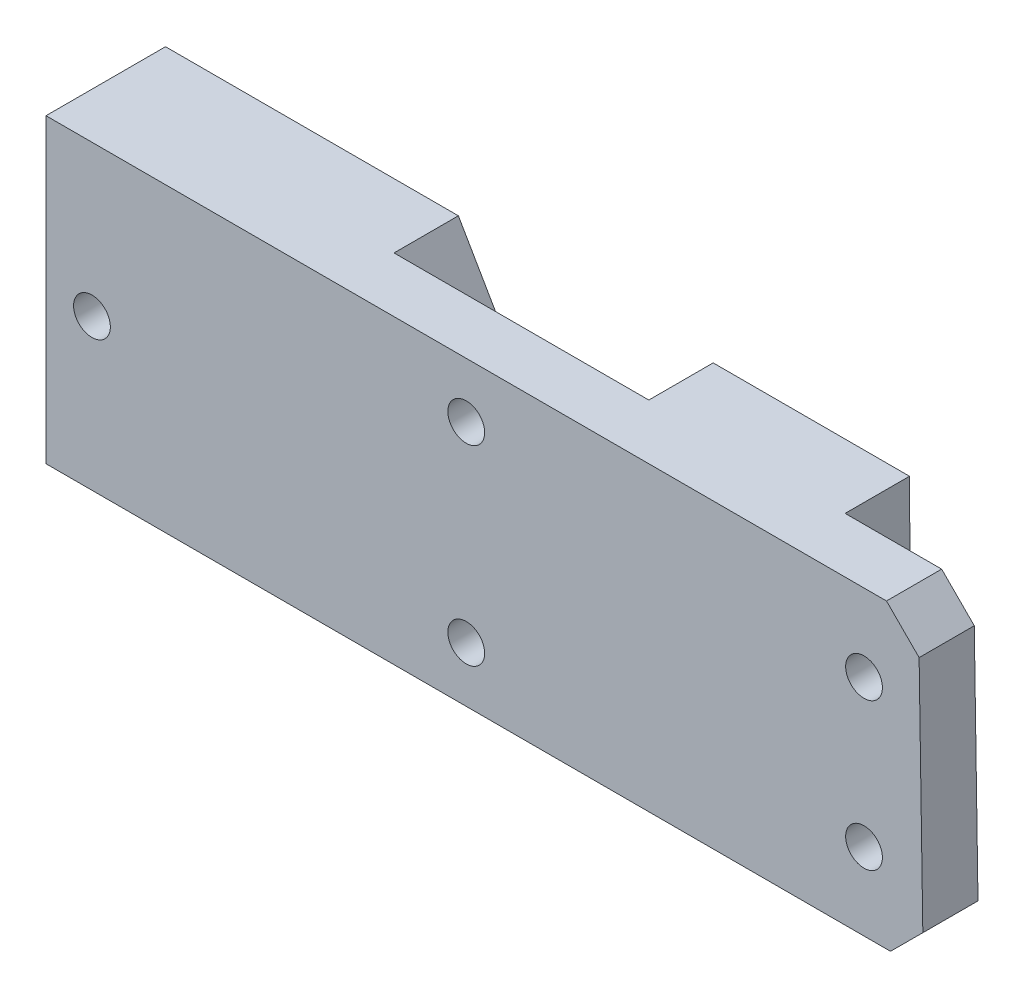
ISO-10303-21;
HEADER;
FILE_DESCRIPTION(('STEP AP214'),'2;1');
FILE_NAME('part.step','',(''),(''),'','','');
FILE_SCHEMA(('AUTOMOTIVE_DESIGN { 1 0 10303 214 1 1 1 1 }'));
ENDSEC;
DATA;
#1=APPLICATION_CONTEXT('core data for automotive mechanical design processes');
#2=APPLICATION_PROTOCOL_DEFINITION('international standard','automotive_design',2000,#1);
#3=PRODUCT_CONTEXT('',#1,'mechanical');
#4=PRODUCT('Part','Part','',(#3));
#5=PRODUCT_RELATED_PRODUCT_CATEGORY('part','',(#4));
#6=PRODUCT_DEFINITION_FORMATION('','',#4);
#7=PRODUCT_DEFINITION_CONTEXT('part definition',#1,'design');
#8=PRODUCT_DEFINITION('design','',#6,#7);
#9=PRODUCT_DEFINITION_SHAPE('','',#8);
#10=(LENGTH_UNIT() NAMED_UNIT(*) SI_UNIT(.MILLI.,.METRE.));
#11=(NAMED_UNIT(*) PLANE_ANGLE_UNIT() SI_UNIT($,.RADIAN.));
#12=(NAMED_UNIT(*) SI_UNIT($,.STERADIAN.) SOLID_ANGLE_UNIT());
#13=UNCERTAINTY_MEASURE_WITH_UNIT(LENGTH_MEASURE(1.E-05),#10,'distance_accuracy_value','');
#14=(GEOMETRIC_REPRESENTATION_CONTEXT(3) GLOBAL_UNCERTAINTY_ASSIGNED_CONTEXT((#13)) GLOBAL_UNIT_ASSIGNED_CONTEXT((#10,
#11,#12)) REPRESENTATION_CONTEXT('',''));
#15=CARTESIAN_POINT('',(0.,0.,0.));
#16=DIRECTION('',(0.,0.,1.));
#17=DIRECTION('',(1.,0.,0.));
#18=AXIS2_PLACEMENT_3D('',#15,#16,#17);
#19=CARTESIAN_POINT('',(44.15,19.0800398226715,106.849030929826));
#20=DIRECTION('',(0.,-1.,0.));
#21=DIRECTION('',(0.,0.,-1.));
#22=AXIS2_PLACEMENT_3D('',#19,#20,#21);
#23=PLANE('',#22);
#24=DIRECTION('',(0.,0.,-1.));
#25=VECTOR('',#24,1.);
#26=CARTESIAN_POINT('',(103.716026260494,19.0800398226714,36.6606055596468));
#27=LINE('',#26,#25);
#28=CARTESIAN_POINT('',(103.716026260494,19.0800398226714,0.));
#29=VERTEX_POINT('',#28);
#30=CARTESIAN_POINT('',(103.716026260494,19.0800398226714,-6.99999999999896));
#31=VERTEX_POINT('',#30);
#32=EDGE_CURVE('E324',#29,#31,#27,.T.);
#33=ORIENTED_EDGE('',*,*,#32,.F.);
#34=DIRECTION('',(1.,0.,0.));
#35=VECTOR('',#34,1.);
#36=CARTESIAN_POINT('',(44.15,19.0800398226715,0.));
#37=LINE('',#36,#35);
#38=CARTESIAN_POINT('',(76.0032133393915,19.0800398226715,0.));
#39=VERTEX_POINT('',#38);
#40=EDGE_CURVE('E11',#39,#29,#37,.T.);
#41=ORIENTED_EDGE('',*,*,#40,.F.);
#42=DIRECTION('',(0.,0.,-1.));
#43=VECTOR('',#42,1.);
#44=CARTESIAN_POINT('',(76.0032133393915,19.0800398226715,36.6606055596468));
#45=LINE('',#44,#43);
#46=CARTESIAN_POINT('',(76.0032133393915,19.0800398226715,-6.99999999999898));
#47=VERTEX_POINT('',#46);
#48=EDGE_CURVE('E310',#39,#47,#45,.T.);
#49=ORIENTED_EDGE('',*,*,#48,.T.);
#50=DIRECTION('',(-1.,0.,0.));
#51=VECTOR('',#50,1.);
#52=CARTESIAN_POINT('',(44.1499999999999,19.0800398226715,-6.99999999999901));
#53=LINE('',#52,#51);
#54=CARTESIAN_POINT('',(44.15,19.0800398226715,-6.999999999999));
#55=VERTEX_POINT('',#54);
#56=EDGE_CURVE('E204',#47,#55,#53,.T.);
#57=ORIENTED_EDGE('',*,*,#56,.T.);
#58=DIRECTION('',(0.,0.,1.));
#59=VECTOR('',#58,1.);
#60=CARTESIAN_POINT('',(44.15,19.0800398226715,-94.5078157313678));
#61=LINE('',#60,#59);
#62=CARTESIAN_POINT('',(44.15,19.0800398226715,0.));
#63=VERTEX_POINT('',#62);
#64=EDGE_CURVE('E222',#55,#63,#61,.T.);
#65=ORIENTED_EDGE('',*,*,#64,.T.);
#66=DIRECTION('',(0.,0.,-1.));
#67=VECTOR('',#66,1.);
#68=CARTESIAN_POINT('',(44.15,19.0800398226715,106.849030929826));
#69=LINE('',#68,#67);
#70=CARTESIAN_POINT('',(44.15,19.0800398226715,6.00000000000386));
#71=VERTEX_POINT('',#70);
#72=EDGE_CURVE('E274',#71,#63,#69,.T.);
#73=ORIENTED_EDGE('',*,*,#72,.F.);
#74=DIRECTION('',(1.,0.,0.));
#75=VECTOR('',#74,1.);
#76=CARTESIAN_POINT('',(44.15,19.0800398226715,6.00000000000386));
#77=LINE('',#76,#75);
#78=CARTESIAN_POINT('',(135.569239599885,19.0800398226715,6.00000000000389));
#79=VERTEX_POINT('',#78);
#80=EDGE_CURVE('E246',#71,#79,#77,.T.);
#81=ORIENTED_EDGE('',*,*,#80,.T.);
#82=DIRECTION('',(0.,0.,-1.));
#83=VECTOR('',#82,1.);
#84=CARTESIAN_POINT('',(135.569239599885,19.0800398226715,106.849030929826));
#85=LINE('',#84,#83);
#86=CARTESIAN_POINT('',(135.569239599885,19.0800398226715,0.));
#87=VERTEX_POINT('',#86);
#88=EDGE_CURVE('E276',#79,#87,#85,.T.);
#89=ORIENTED_EDGE('',*,*,#88,.T.);
#90=DIRECTION('',(-1.,0.,0.));
#91=VECTOR('',#90,1.);
#92=CARTESIAN_POINT('',(44.15,19.0800398226715,0.));
#93=LINE('',#92,#91);
#94=CARTESIAN_POINT('',(125.06945721179,19.0800398226715,0.));
#95=VERTEX_POINT('',#94);
#96=EDGE_CURVE('E271',#87,#95,#93,.T.);
#97=ORIENTED_EDGE('',*,*,#96,.T.);
#98=DIRECTION('',(0.,0.,1.));
#99=VECTOR('',#98,1.);
#100=CARTESIAN_POINT('',(125.06945721179,19.0800398226715,-94.5078157313678));
#101=LINE('',#100,#99);
#102=CARTESIAN_POINT('',(125.06945721179,19.0800398226715,-6.99999999999895));
#103=VERTEX_POINT('',#102);
#104=EDGE_CURVE('E236',#103,#95,#101,.T.);
#105=ORIENTED_EDGE('',*,*,#104,.F.);
#106=EDGE_CURVE('E205',#103,#31,#53,.T.);
#107=ORIENTED_EDGE('',*,*,#106,.T.);
#108=EDGE_LOOP('',(#33,#41,#49,#57,#65,#73,#81,#89,#97,#105,#107));
#109=FACE_BOUND('',#108,.T.);
#110=ADVANCED_FACE('F37',(#109),#23,.F.);
#111=CARTESIAN_POINT('',(135.999179687366,-13.705241551567,106.849030929826));
#112=DIRECTION('',(0.,1.,0.));
#113=DIRECTION('',(-1.,0.,0.));
#114=AXIS2_PLACEMENT_3D('',#111,#112,#113);
#115=PLANE('',#114);
#116=DIRECTION('',(0.,0.,-1.));
#117=VECTOR('',#116,1.);
#118=CARTESIAN_POINT('',(103.930996304234,-13.705241551567,36.6606055596468));
#119=LINE('',#118,#117);
#120=CARTESIAN_POINT('',(103.930996304234,-13.705241551567,0.));
#121=VERTEX_POINT('',#120);
#122=CARTESIAN_POINT('',(103.930996304234,-13.705241551567,-6.99999999999897));
#123=VERTEX_POINT('',#122);
#124=EDGE_CURVE('E172',#121,#123,#119,.T.);
#125=ORIENTED_EDGE('',*,*,#124,.T.);
#126=DIRECTION('',(1.,0.,0.));
#127=VECTOR('',#126,1.);
#128=CARTESIAN_POINT('',(125.284105894422,-13.705241551567,-6.99999999999895));
#129=LINE('',#128,#127);
#130=CARTESIAN_POINT('',(125.284105894422,-13.705241551567,-6.99999999999895));
#131=VERTEX_POINT('',#130);
#132=EDGE_CURVE('E187',#123,#131,#129,.T.);
#133=ORIENTED_EDGE('',*,*,#132,.T.);
#134=DIRECTION('',(0.,0.,1.));
#135=VECTOR('',#134,1.);
#136=CARTESIAN_POINT('',(125.284105894422,-13.705241551567,-94.5078157313678));
#137=LINE('',#136,#135);
#138=CARTESIAN_POINT('',(125.284105894422,-13.705241551567,0.));
#139=VERTEX_POINT('',#138);
#140=EDGE_CURVE('E234',#131,#139,#137,.T.);
#141=ORIENTED_EDGE('',*,*,#140,.T.);
#142=DIRECTION('',(1.,0.,0.));
#143=VECTOR('',#142,1.);
#144=CARTESIAN_POINT('',(135.999179687366,-13.705241551567,0.));
#145=LINE('',#144,#143);
#146=CARTESIAN_POINT('',(135.999179687366,-13.705241551567,0.));
#147=VERTEX_POINT('',#146);
#148=EDGE_CURVE('E260',#139,#147,#145,.T.);
#149=ORIENTED_EDGE('',*,*,#148,.T.);
#150=DIRECTION('',(0.,0.,-1.));
#151=VECTOR('',#150,1.);
#152=CARTESIAN_POINT('',(135.999179687366,-13.705241551567,106.849030929826));
#153=LINE('',#152,#151);
#154=CARTESIAN_POINT('',(135.999179687366,-13.705241551567,6.0000000000039));
#155=VERTEX_POINT('',#154);
#156=EDGE_CURVE('E282',#155,#147,#153,.T.);
#157=ORIENTED_EDGE('',*,*,#156,.F.);
#158=DIRECTION('',(-1.,0.,0.));
#159=VECTOR('',#158,1.);
#160=CARTESIAN_POINT('',(135.999179687366,-13.705241551567,6.00000000000389));
#161=LINE('',#160,#159);
#162=CARTESIAN_POINT('',(44.15,-13.705241551567,6.00000000000385));
#163=VERTEX_POINT('',#162);
#164=EDGE_CURVE('E252',#155,#163,#161,.T.);
#165=ORIENTED_EDGE('',*,*,#164,.T.);
#166=DIRECTION('',(0.,0.,-1.));
#167=VECTOR('',#166,1.);
#168=CARTESIAN_POINT('',(44.15,-13.705241551567,106.849030929826));
#169=LINE('',#168,#167);
#170=CARTESIAN_POINT('',(44.15,-13.705241551567,0.));
#171=VERTEX_POINT('',#170);
#172=EDGE_CURVE('E285',#163,#171,#169,.T.);
#173=ORIENTED_EDGE('',*,*,#172,.T.);
#174=DIRECTION('',(0.,0.,1.));
#175=VECTOR('',#174,1.);
#176=CARTESIAN_POINT('',(44.15,-13.705241551567,-94.5078157313678));
#177=LINE('',#176,#175);
#178=CARTESIAN_POINT('',(44.15,-13.705241551567,-6.99999999999901));
#179=VERTEX_POINT('',#178);
#180=EDGE_CURVE('E231',#179,#171,#177,.T.);
#181=ORIENTED_EDGE('',*,*,#180,.F.);
#182=CARTESIAN_POINT('',(76.2181833831319,-13.705241551567,-6.99999999999899));
#183=VERTEX_POINT('',#182);
#184=EDGE_CURVE('E194',#179,#183,#129,.T.);
#185=ORIENTED_EDGE('',*,*,#184,.T.);
#186=DIRECTION('',(0.,0.,-1.));
#187=VECTOR('',#186,1.);
#188=CARTESIAN_POINT('',(76.2181833831319,-13.705241551567,36.6606055596468));
#189=LINE('',#188,#187);
#190=CARTESIAN_POINT('',(76.2181833831319,-13.705241551567,0.));
#191=VERTEX_POINT('',#190);
#192=EDGE_CURVE('E60',#191,#183,#189,.T.);
#193=ORIENTED_EDGE('',*,*,#192,.F.);
#194=DIRECTION('',(-1.,0.,0.));
#195=VECTOR('',#194,1.);
#196=CARTESIAN_POINT('',(135.999179687366,-13.705241551567,0.));
#197=LINE('',#196,#195);
#198=EDGE_CURVE('E45',#121,#191,#197,.T.);
#199=ORIENTED_EDGE('',*,*,#198,.F.);
#200=EDGE_LOOP('',(#125,#133,#141,#149,#157,#165,#173,#181,#185,#193,#199));
#201=FACE_BOUND('',#200,.T.);
#202=ADVANCED_FACE('F185',(#201),#115,.F.);
#203=CARTESIAN_POINT('',(2.6873991355509,2.68739913555208,-6.99999999999904));
#204=DIRECTION('',(0.,0.,1.));
#205=DIRECTION('',(1.,0.,0.));
#206=AXIS2_PLACEMENT_3D('',#203,#204,#205);
#207=PLANE('',#206);
#208=DIRECTION('',(-0.499999999999999,0.866025403784439,0.));
#209=VECTOR('',#208,1.);
#210=CARTESIAN_POINT('',(71.5218753769855,42.4290025230712,-6.99999999999898));
#211=LINE('',#210,#209);
#212=CARTESIAN_POINT('',(97.0027930739585,-1.70524155156699,-6.99999999999897));
#213=VERTEX_POINT('',#212);
#214=EDGE_CURVE('E169',#123,#213,#211,.T.);
#215=ORIENTED_EDGE('',*,*,#214,.T.);
#216=DIRECTION('',(-1.,0.,0.));
#217=VECTOR('',#216,1.);
#218=CARTESIAN_POINT('',(2.6873991355509,-1.70524155156699,-6.99999999999904));
#219=LINE('',#218,#217);
#220=CARTESIAN_POINT('',(83.1463866134074,-1.70524155156699,-6.99999999999898));
#221=VERTEX_POINT('',#220);
#222=EDGE_CURVE('E180',#213,#221,#219,.T.);
#223=ORIENTED_EDGE('',*,*,#222,.T.);
#224=DIRECTION('',(-0.5,-0.866025403784438,0.));
#225=VECTOR('',#224,1.);
#226=CARTESIAN_POINT('',(64.9337089563144,-33.2505245955266,-6.99999999999899));
#227=LINE('',#226,#225);
#228=EDGE_CURVE('E181',#221,#183,#227,.T.);
#229=ORIENTED_EDGE('',*,*,#228,.T.);
#230=ORIENTED_EDGE('',*,*,#184,.F.);
#231=DIRECTION('',(-0.707106781186549,-0.707106781186546,0.));
#232=VECTOR('',#231,1.);
#233=CARTESIAN_POINT('',(44.15,-13.705241551567,-6.99999999999901));
#234=LINE('',#233,#232);
#235=CARTESIAN_POINT('',(54.15,-3.70524155156703,-6.99999999999899));
#236=VERTEX_POINT('',#235);
#237=EDGE_CURVE('E195',#236,#179,#234,.T.);
#238=ORIENTED_EDGE('',*,*,#237,.F.);
#239=DIRECTION('',(0.,-1.,0.));
#240=VECTOR('',#239,1.);
#241=CARTESIAN_POINT('',(54.15,-3.70524155156704,-6.99999999999899));
#242=LINE('',#241,#240);
#243=CARTESIAN_POINT('',(54.15,9.08003982267148,-6.99999999999899));
#244=VERTEX_POINT('',#243);
#245=EDGE_CURVE('E199',#244,#236,#242,.T.);
#246=ORIENTED_EDGE('',*,*,#245,.F.);
#247=DIRECTION('',(0.707106781186549,-0.707106781186546,0.));
#248=VECTOR('',#247,1.);
#249=CARTESIAN_POINT('',(54.15,9.08003982267151,-6.99999999999899));
#250=LINE('',#249,#248);
#251=EDGE_CURVE('E239',#55,#244,#250,.T.);
#252=ORIENTED_EDGE('',*,*,#251,.F.);
#253=ORIENTED_EDGE('',*,*,#56,.F.);
#254=DIRECTION('',(0.5,-0.866025403784438,0.));
#255=VECTOR('',#254,1.);
#256=CARTESIAN_POINT('',(64.7724814235092,38.5322381071649,-6.99999999999899));
#257=LINE('',#256,#255);
#258=CARTESIAN_POINT('',(82.9314165696671,7.08003982267141,-6.99999999999898));
#259=VERTEX_POINT('',#258);
#260=EDGE_CURVE('E316',#47,#259,#257,.T.);
#261=ORIENTED_EDGE('',*,*,#260,.T.);
#262=DIRECTION('',(1.,0.,0.));
#263=VECTOR('',#262,1.);
#264=CARTESIAN_POINT('',(2.6873991355509,7.08003982267139,-6.99999999999904));
#265=LINE('',#264,#263);
#266=CARTESIAN_POINT('',(96.7878230302181,7.08003982267141,-6.99999999999897));
#267=VERTEX_POINT('',#266);
#268=EDGE_CURVE('E52',#259,#267,#265,.T.);
#269=ORIENTED_EDGE('',*,*,#268,.T.);
#270=DIRECTION('',(0.5,0.866025403784439,0.));
#271=VECTOR('',#270,1.);
#272=CARTESIAN_POINT('',(71.3606478441801,-36.9611194925011,-6.99999999999899));
#273=LINE('',#272,#271);
#274=EDGE_CURVE('E321',#267,#31,#273,.T.);
#275=ORIENTED_EDGE('',*,*,#274,.T.);
#276=ORIENTED_EDGE('',*,*,#106,.F.);
#277=DIRECTION('',(-0.00654696477716311,0.999978568396446,0.));
#278=VECTOR('',#277,1.);
#279=CARTESIAN_POINT('',(125.06945721179,19.0800398226714,-6.99999999999895));
#280=LINE('',#279,#278);
#281=EDGE_CURVE('E192',#131,#103,#280,.T.);
#282=ORIENTED_EDGE('',*,*,#281,.F.);
#283=ORIENTED_EDGE('',*,*,#132,.F.);
#284=EDGE_LOOP('',(#215,#223,#229,#230,#238,#246,#252,#253,#261,#269,#275,#276,#282,#283));
#285=FACE_BOUND('',#284,.T.);
#286=ADVANCED_FACE('F190',(#285),#207,.F.);
#287=CARTESIAN_POINT('',(0.,0.,0.));
#288=DIRECTION('',(0.,0.,-1.));
#289=DIRECTION('',(-1.,0.,0.));
#290=AXIS2_PLACEMENT_3D('',#287,#288,#289);
#291=PLANE('',#290);
#292=CARTESIAN_POINT('',(49.15,2.68739913555222,0.));
#293=DIRECTION('',(0.,0.,-1.));
#294=DIRECTION('',(-1.,0.,0.));
#295=AXIS2_PLACEMENT_3D('',#292,#293,#294);
#296=CIRCLE('',#295,2.);
#297=CARTESIAN_POINT('',(47.15,2.68739913555222,0.));
#298=VERTEX_POINT('',#297);
#299=EDGE_CURVE('E298',#298,#298,#296,.F.);
#300=ORIENTED_EDGE('',*,*,#299,.T.);
#301=EDGE_LOOP('',(#300));
#302=FACE_BOUND('',#301,.T.);
#303=DIRECTION('',(-0.707106781186549,0.707106781186546,0.));
#304=VECTOR('',#303,1.);
#305=CARTESIAN_POINT('',(54.15,9.08003982267148,0.));
#306=LINE('',#305,#304);
#307=CARTESIAN_POINT('',(54.15,9.08003982267148,0.));
#308=VERTEX_POINT('',#307);
#309=EDGE_CURVE('E219',#308,#63,#306,.T.);
#310=ORIENTED_EDGE('',*,*,#309,.F.);
#311=DIRECTION('',(0.,1.,0.));
#312=VECTOR('',#311,1.);
#313=CARTESIAN_POINT('',(54.15,-3.70524155156703,0.));
#314=LINE('',#313,#312);
#315=CARTESIAN_POINT('',(54.15,-3.70524155156703,0.));
#316=VERTEX_POINT('',#315);
#317=EDGE_CURVE('E216',#316,#308,#314,.T.);
#318=ORIENTED_EDGE('',*,*,#317,.F.);
#319=DIRECTION('',(0.707106781186549,0.707106781186546,0.));
#320=VECTOR('',#319,1.);
#321=CARTESIAN_POINT('',(44.15,-13.705241551567,0.));
#322=LINE('',#321,#320);
#323=EDGE_CURVE('E212',#171,#316,#322,.T.);
#324=ORIENTED_EDGE('',*,*,#323,.F.);
#325=DIRECTION('',(0.,-1.,0.));
#326=VECTOR('',#325,1.);
#327=CARTESIAN_POINT('',(44.15,19.0800398226715,0.));
#328=LINE('',#327,#326);
#329=EDGE_CURVE('E208',#63,#171,#328,.T.);
#330=ORIENTED_EDGE('',*,*,#329,.F.);
#331=EDGE_LOOP('',(#310,#318,#324,#330));
#332=FACE_BOUND('',#331,.T.);
#333=ADVANCED_FACE('F359',(#302,#332),#291,.T.);
#334=CARTESIAN_POINT('',(133.124576168872,10.687399135553,0.));
#335=DIRECTION('',(0.,0.,-1.));
#336=DIRECTION('',(-1.,0.,0.));
#337=AXIS2_PLACEMENT_3D('',#334,#335,#336);
#338=CIRCLE('',#337,2.);
#339=CARTESIAN_POINT('',(131.124576168872,10.687399135553,0.));
#340=VERTEX_POINT('',#339);
#341=EDGE_CURVE('E334',#340,#340,#338,.F.);
#342=ORIENTED_EDGE('',*,*,#341,.T.);
#343=EDGE_LOOP('',(#342));
#344=FACE_BOUND('',#343,.T.);
#345=CARTESIAN_POINT('',(133.124576168872,-5.31260086444701,0.));
#346=DIRECTION('',(0.,0.,-1.));
#347=DIRECTION('',(-1.,0.,0.));
#348=AXIS2_PLACEMENT_3D('',#345,#346,#347);
#349=CIRCLE('',#348,2.);
#350=CARTESIAN_POINT('',(131.124576168872,-5.31260086444701,0.));
#351=VERTEX_POINT('',#350);
#352=EDGE_CURVE('E340',#351,#351,#349,.F.);
#353=ORIENTED_EDGE('',*,*,#352,.T.);
#354=EDGE_LOOP('',(#353));
#355=FACE_BOUND('',#354,.T.);
#356=DIRECTION('',(0.00654696477716311,-0.999978568396446,0.));
#357=VECTOR('',#356,1.);
#358=CARTESIAN_POINT('',(125.06945721179,19.0800398226715,0.));
#359=LINE('',#358,#357);
#360=EDGE_CURVE('E209',#95,#139,#359,.T.);
#361=ORIENTED_EDGE('',*,*,#360,.F.);
#362=ORIENTED_EDGE('',*,*,#96,.F.);
#363=DIRECTION('',(-0.705832458569855,0.708378811392064,0.));
#364=VECTOR('',#363,1.);
#365=CARTESIAN_POINT('',(135.569239599885,19.0800398226715,0.));
#366=LINE('',#365,#364);
#367=CARTESIAN_POINT('',(139.116658887016,15.5198229077135,0.));
#368=VERTEX_POINT('',#367);
#369=EDGE_CURVE('E268',#368,#87,#366,.T.);
#370=ORIENTED_EDGE('',*,*,#369,.F.);
#371=DIRECTION('',(-0.0157265614898397,0.999876329984717,0.));
#372=VECTOR('',#371,1.);
#373=CARTESIAN_POINT('',(139.116658887016,15.5198229077135,0.));
#374=LINE('',#373,#372);
#375=CARTESIAN_POINT('',(139.521129618435,-10.1959516930502,0.));
#376=VERTEX_POINT('',#375);
#377=EDGE_CURVE('E265',#376,#368,#374,.T.);
#378=ORIENTED_EDGE('',*,*,#377,.F.);
#379=DIRECTION('',(0.708378811392067,0.705832458569852,0.));
#380=VECTOR('',#379,1.);
#381=CARTESIAN_POINT('',(139.521129618435,-10.1959516930502,0.));
#382=LINE('',#381,#380);
#383=EDGE_CURVE('E262',#147,#376,#382,.T.);
#384=ORIENTED_EDGE('',*,*,#383,.F.);
#385=ORIENTED_EDGE('',*,*,#148,.F.);
#386=EDGE_LOOP('',(#361,#362,#370,#378,#384,#385));
#387=FACE_BOUND('',#386,.T.);
#388=ADVANCED_FACE('F388',(#344,#355,#387),#291,.T.);
#389=CARTESIAN_POINT('',(135.569239599885,19.0800398226715,106.849030929826));
#390=DIRECTION('',(-0.708378811392064,-0.705832458569855,0.));
#391=DIRECTION('',(0.705832458569856,-0.708378811392064,0.));
#392=AXIS2_PLACEMENT_3D('',#389,#390,#391);
#393=PLANE('',#392);
#394=ORIENTED_EDGE('',*,*,#88,.F.);
#395=DIRECTION('',(0.705832458569856,-0.708378811392064,0.));
#396=VECTOR('',#395,1.);
#397=CARTESIAN_POINT('',(135.569239599885,19.0800398226714,6.00000000000391));
#398=LINE('',#397,#396);
#399=CARTESIAN_POINT('',(139.116658887016,15.5198229077135,6.00000000000391));
#400=VERTEX_POINT('',#399);
#401=EDGE_CURVE('E242',#79,#400,#398,.T.);
#402=ORIENTED_EDGE('',*,*,#401,.T.);
#403=DIRECTION('',(0.,0.,-1.));
#404=VECTOR('',#403,1.);
#405=CARTESIAN_POINT('',(139.116658887016,15.5198229077135,106.849030929826));
#406=LINE('',#405,#404);
#407=EDGE_CURVE('E278',#400,#368,#406,.T.);
#408=ORIENTED_EDGE('',*,*,#407,.T.);
#409=ORIENTED_EDGE('',*,*,#369,.T.);
#410=EDGE_LOOP('',(#394,#402,#408,#409));
#411=FACE_BOUND('',#410,.T.);
#412=ADVANCED_FACE('F389',(#411),#393,.F.);
#413=CARTESIAN_POINT('',(139.116658887016,15.5198229077135,106.849030929826));
#414=DIRECTION('',(-0.999876329984717,-0.0157265614898397,0.));
#415=DIRECTION('',(0.0157265614898397,-0.999876329984717,0.));
#416=AXIS2_PLACEMENT_3D('',#413,#414,#415);
#417=PLANE('',#416);
#418=ORIENTED_EDGE('',*,*,#407,.F.);
#419=DIRECTION('',(0.0157265614898397,-0.999876329984717,0.));
#420=VECTOR('',#419,1.);
#421=CARTESIAN_POINT('',(139.116658887016,15.5198229077135,6.00000000000391));
#422=LINE('',#421,#420);
#423=CARTESIAN_POINT('',(139.521129618435,-10.1959516930502,6.0000000000039));
#424=VERTEX_POINT('',#423);
#425=EDGE_CURVE('E245',#400,#424,#422,.T.);
#426=ORIENTED_EDGE('',*,*,#425,.T.);
#427=DIRECTION('',(0.,0.,-1.));
#428=VECTOR('',#427,1.);
#429=CARTESIAN_POINT('',(139.521129618435,-10.1959516930502,106.849030929826));
#430=LINE('',#429,#428);
#431=EDGE_CURVE('E280',#424,#376,#430,.T.);
#432=ORIENTED_EDGE('',*,*,#431,.T.);
#433=ORIENTED_EDGE('',*,*,#377,.T.);
#434=EDGE_LOOP('',(#418,#426,#432,#433));
#435=FACE_BOUND('',#434,.T.);
#436=ADVANCED_FACE('F392',(#435),#417,.F.);
#437=CARTESIAN_POINT('',(139.521129618435,-10.1959516930502,106.849030929826));
#438=DIRECTION('',(-0.705832458569852,0.708378811392067,0.));
#439=DIRECTION('',(-0.708378811392067,-0.705832458569852,0.));
#440=AXIS2_PLACEMENT_3D('',#437,#438,#439);
#441=PLANE('',#440);
#442=ORIENTED_EDGE('',*,*,#431,.F.);
#443=DIRECTION('',(-0.708378811392067,-0.705832458569852,0.));
#444=VECTOR('',#443,1.);
#445=CARTESIAN_POINT('',(139.521129618435,-10.1959516930501,6.00000000000391));
#446=LINE('',#445,#444);
#447=EDGE_CURVE('E249',#424,#155,#446,.T.);
#448=ORIENTED_EDGE('',*,*,#447,.T.);
#449=ORIENTED_EDGE('',*,*,#156,.T.);
#450=ORIENTED_EDGE('',*,*,#383,.T.);
#451=EDGE_LOOP('',(#442,#448,#449,#450));
#452=FACE_BOUND('',#451,.T.);
#453=ADVANCED_FACE('F396',(#452),#441,.F.);
#454=CARTESIAN_POINT('',(44.15,19.0800398226715,106.849030929826));
#455=DIRECTION('',(1.,0.,0.));
#456=DIRECTION('',(0.,1.,0.));
#457=AXIS2_PLACEMENT_3D('',#454,#455,#456);
#458=PLANE('',#457);
#459=ORIENTED_EDGE('',*,*,#172,.F.);
#460=DIRECTION('',(0.,1.,0.));
#461=VECTOR('',#460,1.);
#462=CARTESIAN_POINT('',(44.15,19.0800398226715,6.00000000000386));
#463=LINE('',#462,#461);
#464=EDGE_CURVE('E255',#163,#71,#463,.T.);
#465=ORIENTED_EDGE('',*,*,#464,.T.);
#466=ORIENTED_EDGE('',*,*,#72,.T.);
#467=ORIENTED_EDGE('',*,*,#329,.T.);
#468=EDGE_LOOP('',(#459,#465,#466,#467));
#469=FACE_BOUND('',#468,.T.);
#470=ADVANCED_FACE('F39',(#469),#458,.F.);
#471=CARTESIAN_POINT('',(171.999999999999,2.68739913555305,6.00000000000392));
#472=DIRECTION('',(0.,0.,-1.));
#473=DIRECTION('',(1.,0.,0.));
#474=AXIS2_PLACEMENT_3D('',#471,#472,#473);
#475=PLANE('',#474);
#476=CARTESIAN_POINT('',(89.8596197999426,13.0800398226714,6.00000000000389));
#477=DIRECTION('',(0.,0.,-1.));
#478=DIRECTION('',(-1.,0.,0.));
#479=AXIS2_PLACEMENT_3D('',#476,#477,#478);
#480=CIRCLE('',#479,2.);
#481=CARTESIAN_POINT('',(87.8596197999425,13.0800398226714,6.00000000000389));
#482=VERTEX_POINT('',#481);
#483=EDGE_CURVE('E319',#482,#482,#480,.F.);
#484=ORIENTED_EDGE('',*,*,#483,.F.);
#485=EDGE_LOOP('',(#484));
#486=FACE_BOUND('',#485,.T.);
#487=CARTESIAN_POINT('',(89.8596197999426,-7.70524155156699,6.00000000000388));
#488=DIRECTION('',(0.,0.,-1.));
#489=DIRECTION('',(-1.,0.,0.));
#490=AXIS2_PLACEMENT_3D('',#487,#488,#489);
#491=CIRCLE('',#490,2.);
#492=CARTESIAN_POINT('',(87.8596197999425,-7.70524155156699,6.00000000000388));
#493=VERTEX_POINT('',#492);
#494=EDGE_CURVE('E581',#493,#493,#491,.F.);
#495=ORIENTED_EDGE('',*,*,#494,.F.);
#496=EDGE_LOOP('',(#495));
#497=FACE_BOUND('',#496,.T.);
#498=CARTESIAN_POINT('',(133.124576168872,10.687399135553,6.00000000000391));
#499=DIRECTION('',(0.,0.,-1.));
#500=DIRECTION('',(-1.,0.,0.));
#501=AXIS2_PLACEMENT_3D('',#498,#499,#500);
#502=CIRCLE('',#501,2.);
#503=CARTESIAN_POINT('',(131.124576168872,10.687399135553,6.00000000000391));
#504=VERTEX_POINT('',#503);
#505=EDGE_CURVE('E213',#504,#504,#502,.F.);
#506=ORIENTED_EDGE('',*,*,#505,.F.);
#507=EDGE_LOOP('',(#506));
#508=FACE_BOUND('',#507,.T.);
#509=CARTESIAN_POINT('',(133.124576168872,-5.31260086444701,6.0000000000039));
#510=DIRECTION('',(0.,0.,-1.));
#511=DIRECTION('',(-1.,0.,0.));
#512=AXIS2_PLACEMENT_3D('',#509,#510,#511);
#513=CIRCLE('',#512,2.);
#514=CARTESIAN_POINT('',(131.124576168872,-5.31260086444701,6.0000000000039));
#515=VERTEX_POINT('',#514);
#516=EDGE_CURVE('E337',#515,#515,#513,.F.);
#517=ORIENTED_EDGE('',*,*,#516,.F.);
#518=EDGE_LOOP('',(#517));
#519=FACE_BOUND('',#518,.T.);
#520=CARTESIAN_POINT('',(49.15,2.68739913555222,6.00000000000387));
#521=DIRECTION('',(0.,0.,-1.));
#522=DIRECTION('',(-1.,0.,0.));
#523=AXIS2_PLACEMENT_3D('',#520,#521,#522);
#524=CIRCLE('',#523,2.);
#525=CARTESIAN_POINT('',(47.15,2.68739913555222,6.00000000000387));
#526=VERTEX_POINT('',#525);
#527=EDGE_CURVE('E343',#526,#526,#524,.F.);
#528=ORIENTED_EDGE('',*,*,#527,.F.);
#529=EDGE_LOOP('',(#528));
#530=FACE_BOUND('',#529,.T.);
#531=ORIENTED_EDGE('',*,*,#164,.F.);
#532=ORIENTED_EDGE('',*,*,#447,.F.);
#533=ORIENTED_EDGE('',*,*,#425,.F.);
#534=ORIENTED_EDGE('',*,*,#401,.F.);
#535=ORIENTED_EDGE('',*,*,#80,.F.);
#536=ORIENTED_EDGE('',*,*,#464,.F.);
#537=EDGE_LOOP('',(#531,#532,#533,#534,#535,#536));
#538=FACE_BOUND('',#537,.T.);
#539=ADVANCED_FACE('F369',(#486,#497,#508,#519,#530,#538),#475,.F.);
#540=CARTESIAN_POINT('',(54.15,9.08003982267148,-94.5078157313678));
#541=DIRECTION('',(0.707106781186546,0.707106781186549,0.));
#542=DIRECTION('',(-0.707106781186549,0.707106781186546,0.));
#543=AXIS2_PLACEMENT_3D('',#540,#541,#542);
#544=PLANE('',#543);
#545=ORIENTED_EDGE('',*,*,#64,.F.);
#546=ORIENTED_EDGE('',*,*,#251,.T.);
#547=DIRECTION('',(0.,0.,1.));
#548=VECTOR('',#547,1.);
#549=CARTESIAN_POINT('',(54.15,9.08003982267148,-94.5078157313678));
#550=LINE('',#549,#548);
#551=EDGE_CURVE('E225',#244,#308,#550,.T.);
#552=ORIENTED_EDGE('',*,*,#551,.T.);
#553=ORIENTED_EDGE('',*,*,#309,.T.);
#554=EDGE_LOOP('',(#545,#546,#552,#553));
#555=FACE_BOUND('',#554,.T.);
#556=ADVANCED_FACE('F367',(#555),#544,.F.);
#557=CARTESIAN_POINT('',(54.15,-3.70524155156703,-94.5078157313678));
#558=DIRECTION('',(1.,0.,0.));
#559=DIRECTION('',(0.,0.,-1.));
#560=AXIS2_PLACEMENT_3D('',#557,#558,#559);
#561=PLANE('',#560);
#562=ORIENTED_EDGE('',*,*,#551,.F.);
#563=ORIENTED_EDGE('',*,*,#245,.T.);
#564=DIRECTION('',(0.,0.,1.));
#565=VECTOR('',#564,1.);
#566=CARTESIAN_POINT('',(54.15,-3.70524155156703,-94.5078157313678));
#567=LINE('',#566,#565);
#568=EDGE_CURVE('E228',#236,#316,#567,.T.);
#569=ORIENTED_EDGE('',*,*,#568,.T.);
#570=ORIENTED_EDGE('',*,*,#317,.T.);
#571=EDGE_LOOP('',(#562,#563,#569,#570));
#572=FACE_BOUND('',#571,.T.);
#573=ADVANCED_FACE('F350',(#572),#561,.F.);
#574=CARTESIAN_POINT('',(44.15,-13.705241551567,-94.5078157313678));
#575=DIRECTION('',(0.707106781186546,-0.707106781186549,0.));
#576=DIRECTION('',(0.707106781186549,0.707106781186546,0.));
#577=AXIS2_PLACEMENT_3D('',#574,#575,#576);
#578=PLANE('',#577);
#579=ORIENTED_EDGE('',*,*,#568,.F.);
#580=ORIENTED_EDGE('',*,*,#237,.T.);
#581=ORIENTED_EDGE('',*,*,#180,.T.);
#582=ORIENTED_EDGE('',*,*,#323,.T.);
#583=EDGE_LOOP('',(#579,#580,#581,#582));
#584=FACE_BOUND('',#583,.T.);
#585=ADVANCED_FACE('F356',(#584),#578,.F.);
#586=CARTESIAN_POINT('',(125.06945721179,19.0800398226715,-94.5078157313678));
#587=DIRECTION('',(-0.999978568396446,-0.00654696477716311,0.));
#588=DIRECTION('',(0.00654696477716311,-0.999978568396446,0.));
#589=AXIS2_PLACEMENT_3D('',#586,#587,#588);
#590=PLANE('',#589);
#591=ORIENTED_EDGE('',*,*,#140,.F.);
#592=ORIENTED_EDGE('',*,*,#281,.T.);
#593=ORIENTED_EDGE('',*,*,#104,.T.);
#594=ORIENTED_EDGE('',*,*,#360,.T.);
#595=EDGE_LOOP('',(#591,#592,#593,#594));
#596=FACE_BOUND('',#595,.T.);
#597=ADVANCED_FACE('F413',(#596),#590,.F.);
#598=CARTESIAN_POINT('',(49.15,2.68739913555222,6.00100000000391));
#599=DIRECTION('',(0.,0.,-1.));
#600=DIRECTION('',(-1.,0.,0.));
#601=AXIS2_PLACEMENT_3D('',#598,#599,#600);
#602=CYLINDRICAL_SURFACE('',#601,2.);
#603=ORIENTED_EDGE('',*,*,#299,.F.);
#604=EDGE_LOOP('',(#603));
#605=FACE_BOUND('',#604,.T.);
#606=ORIENTED_EDGE('',*,*,#527,.T.);
#607=EDGE_LOOP('',(#606));
#608=FACE_BOUND('',#607,.T.);
#609=ADVANCED_FACE('F415',(#605,#608),#602,.F.);
#610=CARTESIAN_POINT('',(133.124576168872,-5.31260086444701,6.00100000000397));
#611=DIRECTION('',(0.,0.,-1.));
#612=DIRECTION('',(-1.,0.,0.));
#613=AXIS2_PLACEMENT_3D('',#610,#611,#612);
#614=CYLINDRICAL_SURFACE('',#613,2.);
#615=ORIENTED_EDGE('',*,*,#352,.F.);
#616=EDGE_LOOP('',(#615));
#617=FACE_BOUND('',#616,.T.);
#618=ORIENTED_EDGE('',*,*,#516,.T.);
#619=EDGE_LOOP('',(#618));
#620=FACE_BOUND('',#619,.T.);
#621=ADVANCED_FACE('F422',(#617,#620),#614,.F.);
#622=CARTESIAN_POINT('',(133.124576168872,10.687399135553,6.00100000000397));
#623=DIRECTION('',(0.,0.,-1.));
#624=DIRECTION('',(-1.,0.,0.));
#625=AXIS2_PLACEMENT_3D('',#622,#623,#624);
#626=CYLINDRICAL_SURFACE('',#625,2.);
#627=ORIENTED_EDGE('',*,*,#341,.F.);
#628=EDGE_LOOP('',(#627));
#629=FACE_BOUND('',#628,.T.);
#630=ORIENTED_EDGE('',*,*,#505,.T.);
#631=EDGE_LOOP('',(#630));
#632=FACE_BOUND('',#631,.T.);
#633=ADVANCED_FACE('F474',(#629,#632),#626,.F.);
#634=CARTESIAN_POINT('',(171.999999999999,2.68739913555305,0.));
#635=DIRECTION('',(0.,0.,-1.));
#636=DIRECTION('',(0.,-1.,0.));
#637=AXIS2_PLACEMENT_3D('',#634,#635,#636);
#638=PLANE('',#637);
#639=CARTESIAN_POINT('',(89.8596197999426,13.0800398226714,0.));
#640=DIRECTION('',(0.,0.,-1.));
#641=DIRECTION('',(-1.,0.,0.));
#642=AXIS2_PLACEMENT_3D('',#639,#640,#641);
#643=CIRCLE('',#642,2.);
#644=CARTESIAN_POINT('',(87.8596197999425,13.0800398226714,0.));
#645=VERTEX_POINT('',#644);
#646=EDGE_CURVE('E577',#645,#645,#643,.T.);
#647=ORIENTED_EDGE('',*,*,#646,.F.);
#648=EDGE_LOOP('',(#647));
#649=FACE_BOUND('',#648,.T.);
#650=ORIENTED_EDGE('',*,*,#40,.T.);
#651=DIRECTION('',(-0.5,-0.866025403784439,0.));
#652=VECTOR('',#651,1.);
#653=CARTESIAN_POINT('',(71.3606478441801,-36.9611194925011,0.));
#654=LINE('',#653,#652);
#655=CARTESIAN_POINT('',(96.7878230302181,7.08003982267141,0.));
#656=VERTEX_POINT('',#655);
#657=EDGE_CURVE('E306',#29,#656,#654,.T.);
#658=ORIENTED_EDGE('',*,*,#657,.T.);
#659=DIRECTION('',(-1.,0.,0.));
#660=VECTOR('',#659,1.);
#661=CARTESIAN_POINT('',(2.68739913555091,7.08003982267139,0.));
#662=LINE('',#661,#660);
#663=CARTESIAN_POINT('',(82.9314165696671,7.08003982267141,0.));
#664=VERTEX_POINT('',#663);
#665=EDGE_CURVE('E309',#656,#664,#662,.T.);
#666=ORIENTED_EDGE('',*,*,#665,.T.);
#667=DIRECTION('',(-0.5,0.866025403784438,0.));
#668=VECTOR('',#667,1.);
#669=CARTESIAN_POINT('',(64.7724814235092,38.5322381071649,0.));
#670=LINE('',#669,#668);
#671=EDGE_CURVE('E313',#664,#39,#670,.T.);
#672=ORIENTED_EDGE('',*,*,#671,.T.);
#673=EDGE_LOOP('',(#650,#658,#666,#672));
#674=FACE_BOUND('',#673,.T.);
#675=ADVANCED_FACE('F481',(#649,#674),#638,.T.);
#676=CARTESIAN_POINT('',(71.3606478441801,-36.9611194925011,36.6606055596468));
#677=DIRECTION('',(-0.866025403784439,0.5,0.));
#678=DIRECTION('',(-0.5,-0.866025403784439,0.));
#679=AXIS2_PLACEMENT_3D('',#676,#677,#678);
#680=PLANE('',#679);
#681=ORIENTED_EDGE('',*,*,#32,.T.);
#682=ORIENTED_EDGE('',*,*,#274,.F.);
#683=DIRECTION('',(0.,0.,-1.));
#684=VECTOR('',#683,1.);
#685=CARTESIAN_POINT('',(96.7878230302181,7.08003982267141,36.6606055596468));
#686=LINE('',#685,#684);
#687=EDGE_CURVE('E326',#656,#267,#686,.T.);
#688=ORIENTED_EDGE('',*,*,#687,.F.);
#689=ORIENTED_EDGE('',*,*,#657,.F.);
#690=EDGE_LOOP('',(#681,#682,#688,#689));
#691=FACE_BOUND('',#690,.T.);
#692=ADVANCED_FACE('F508',(#691),#680,.T.);
#693=CARTESIAN_POINT('',(2.6873991355509,7.08003982267139,36.6606055596467));
#694=DIRECTION('',(0.,1.,0.));
#695=DIRECTION('',(-1.,0.,0.));
#696=AXIS2_PLACEMENT_3D('',#693,#694,#695);
#697=PLANE('',#696);
#698=ORIENTED_EDGE('',*,*,#687,.T.);
#699=ORIENTED_EDGE('',*,*,#268,.F.);
#700=DIRECTION('',(0.,0.,-1.));
#701=VECTOR('',#700,1.);
#702=CARTESIAN_POINT('',(82.9314165696671,7.08003982267141,36.6606055596468));
#703=LINE('',#702,#701);
#704=EDGE_CURVE('E328',#664,#259,#703,.T.);
#705=ORIENTED_EDGE('',*,*,#704,.F.);
#706=ORIENTED_EDGE('',*,*,#665,.F.);
#707=EDGE_LOOP('',(#698,#699,#705,#706));
#708=FACE_BOUND('',#707,.T.);
#709=ADVANCED_FACE('F516',(#708),#697,.T.);
#710=CARTESIAN_POINT('',(64.7724814235092,38.5322381071649,36.6606055596468));
#711=DIRECTION('',(0.866025403784438,0.5,0.));
#712=DIRECTION('',(-0.5,0.866025403784438,0.));
#713=AXIS2_PLACEMENT_3D('',#710,#711,#712);
#714=PLANE('',#713);
#715=ORIENTED_EDGE('',*,*,#704,.T.);
#716=ORIENTED_EDGE('',*,*,#260,.F.);
#717=ORIENTED_EDGE('',*,*,#48,.F.);
#718=ORIENTED_EDGE('',*,*,#671,.F.);
#719=EDGE_LOOP('',(#715,#716,#717,#718));
#720=FACE_BOUND('',#719,.T.);
#721=ADVANCED_FACE('F524',(#720),#714,.T.);
#722=CARTESIAN_POINT('',(171.999999999999,2.68739913555305,0.));
#723=DIRECTION('',(0.,0.,-1.));
#724=DIRECTION('',(0.,-1.,0.));
#725=AXIS2_PLACEMENT_3D('',#722,#723,#724);
#726=PLANE('',#725);
#727=CARTESIAN_POINT('',(89.8596197999426,-7.70524155156699,0.));
#728=DIRECTION('',(0.,0.,-1.));
#729=DIRECTION('',(-1.,0.,0.));
#730=AXIS2_PLACEMENT_3D('',#727,#728,#729);
#731=CIRCLE('',#730,2.);
#732=CARTESIAN_POINT('',(87.8596197999425,-7.70524155156699,0.));
#733=VERTEX_POINT('',#732);
#734=EDGE_CURVE('E584',#733,#733,#731,.T.);
#735=ORIENTED_EDGE('',*,*,#734,.F.);
#736=EDGE_LOOP('',(#735));
#737=FACE_BOUND('',#736,.T.);
#738=ORIENTED_EDGE('',*,*,#198,.T.);
#739=DIRECTION('',(0.5,0.866025403784438,0.));
#740=VECTOR('',#739,1.);
#741=CARTESIAN_POINT('',(64.9337089563144,-33.2505245955266,0.));
#742=LINE('',#741,#740);
#743=CARTESIAN_POINT('',(83.1463866134074,-1.70524155156699,0.));
#744=VERTEX_POINT('',#743);
#745=EDGE_CURVE('E293',#191,#744,#742,.T.);
#746=ORIENTED_EDGE('',*,*,#745,.T.);
#747=DIRECTION('',(1.,0.,0.));
#748=VECTOR('',#747,1.);
#749=CARTESIAN_POINT('',(2.68739913555091,-1.70524155156699,0.));
#750=LINE('',#749,#748);
#751=CARTESIAN_POINT('',(97.0027930739585,-1.70524155156699,0.));
#752=VERTEX_POINT('',#751);
#753=EDGE_CURVE('E301',#744,#752,#750,.T.);
#754=ORIENTED_EDGE('',*,*,#753,.T.);
#755=DIRECTION('',(0.499999999999999,-0.866025403784439,0.));
#756=VECTOR('',#755,1.);
#757=CARTESIAN_POINT('',(71.5218753769855,42.4290025230712,0.));
#758=LINE('',#757,#756);
#759=EDGE_CURVE('E295',#752,#121,#758,.T.);
#760=ORIENTED_EDGE('',*,*,#759,.T.);
#761=EDGE_LOOP('',(#738,#746,#754,#760));
#762=FACE_BOUND('',#761,.T.);
#763=ADVANCED_FACE('F291',(#737,#762),#726,.T.);
#764=CARTESIAN_POINT('',(2.6873991355509,-1.70524155156699,36.6606055596467));
#765=DIRECTION('',(0.,-1.,0.));
#766=DIRECTION('',(0.,0.,-1.));
#767=AXIS2_PLACEMENT_3D('',#764,#765,#766);
#768=PLANE('',#767);
#769=DIRECTION('',(0.,0.,-1.));
#770=VECTOR('',#769,1.);
#771=CARTESIAN_POINT('',(83.1463866134074,-1.70524155156699,36.6606055596468));
#772=LINE('',#771,#770);
#773=EDGE_CURVE('E297',#744,#221,#772,.T.);
#774=ORIENTED_EDGE('',*,*,#773,.T.);
#775=ORIENTED_EDGE('',*,*,#222,.F.);
#776=DIRECTION('',(0.,0.,-1.));
#777=VECTOR('',#776,1.);
#778=CARTESIAN_POINT('',(97.0027930739585,-1.70524155156699,36.6606055596468));
#779=LINE('',#778,#777);
#780=EDGE_CURVE('E175',#752,#213,#779,.T.);
#781=ORIENTED_EDGE('',*,*,#780,.F.);
#782=ORIENTED_EDGE('',*,*,#753,.F.);
#783=EDGE_LOOP('',(#774,#775,#781,#782));
#784=FACE_BOUND('',#783,.T.);
#785=ADVANCED_FACE('F538',(#784),#768,.T.);
#786=CARTESIAN_POINT('',(71.5218753769855,42.4290025230712,36.6606055596468));
#787=DIRECTION('',(-0.866025403784439,-0.499999999999999,0.));
#788=DIRECTION('',(0.499999999999999,-0.866025403784439,0.));
#789=AXIS2_PLACEMENT_3D('',#786,#787,#788);
#790=PLANE('',#789);
#791=ORIENTED_EDGE('',*,*,#780,.T.);
#792=ORIENTED_EDGE('',*,*,#214,.F.);
#793=ORIENTED_EDGE('',*,*,#124,.F.);
#794=ORIENTED_EDGE('',*,*,#759,.F.);
#795=EDGE_LOOP('',(#791,#792,#793,#794));
#796=FACE_BOUND('',#795,.T.);
#797=ADVANCED_FACE('F171',(#796),#790,.T.);
#798=CARTESIAN_POINT('',(64.9337089563144,-33.2505245955266,36.6606055596468));
#799=DIRECTION('',(0.866025403784438,-0.5,0.));
#800=DIRECTION('',(0.5,0.866025403784438,0.));
#801=AXIS2_PLACEMENT_3D('',#798,#799,#800);
#802=PLANE('',#801);
#803=ORIENTED_EDGE('',*,*,#192,.T.);
#804=ORIENTED_EDGE('',*,*,#228,.F.);
#805=ORIENTED_EDGE('',*,*,#773,.F.);
#806=ORIENTED_EDGE('',*,*,#745,.F.);
#807=EDGE_LOOP('',(#803,#804,#805,#806));
#808=FACE_BOUND('',#807,.T.);
#809=ADVANCED_FACE('F296',(#808),#802,.T.);
#810=CARTESIAN_POINT('',(89.8596197999426,-7.70524155156699,6.00100000000392));
#811=DIRECTION('',(0.,0.,-1.));
#812=DIRECTION('',(-1.,0.,0.));
#813=AXIS2_PLACEMENT_3D('',#810,#811,#812);
#814=CYLINDRICAL_SURFACE('',#813,2.);
#815=ORIENTED_EDGE('',*,*,#734,.T.);
#816=EDGE_LOOP('',(#815));
#817=FACE_BOUND('',#816,.T.);
#818=ORIENTED_EDGE('',*,*,#494,.T.);
#819=EDGE_LOOP('',(#818));
#820=FACE_BOUND('',#819,.T.);
#821=ADVANCED_FACE('F558',(#817,#820),#814,.F.);
#822=CARTESIAN_POINT('',(89.8596197999426,13.0800398226714,6.00100000000392));
#823=DIRECTION('',(0.,0.,-1.));
#824=DIRECTION('',(-1.,0.,0.));
#825=AXIS2_PLACEMENT_3D('',#822,#823,#824);
#826=CYLINDRICAL_SURFACE('',#825,2.);
#827=ORIENTED_EDGE('',*,*,#646,.T.);
#828=EDGE_LOOP('',(#827));
#829=FACE_BOUND('',#828,.T.);
#830=ORIENTED_EDGE('',*,*,#483,.T.);
#831=EDGE_LOOP('',(#830));
#832=FACE_BOUND('',#831,.T.);
#833=ADVANCED_FACE('F564',(#829,#832),#826,.F.);
#834=CLOSED_SHELL('',(#110,#202,#286,#333,#388,#412,#436,#453,#470,#539,#556,#573,#585,#597,
#609,#621,#633,#675,#692,#709,#721,#763,#785,#797,#809,#821,#833));
#835=MANIFOLD_SOLID_BREP('B2',#834);
#836=ADVANCED_BREP_SHAPE_REPRESENTATION('',(#18,#835),#14);
#837=SHAPE_DEFINITION_REPRESENTATION(#9,#836);
ENDSEC;
END-ISO-10303-21;
